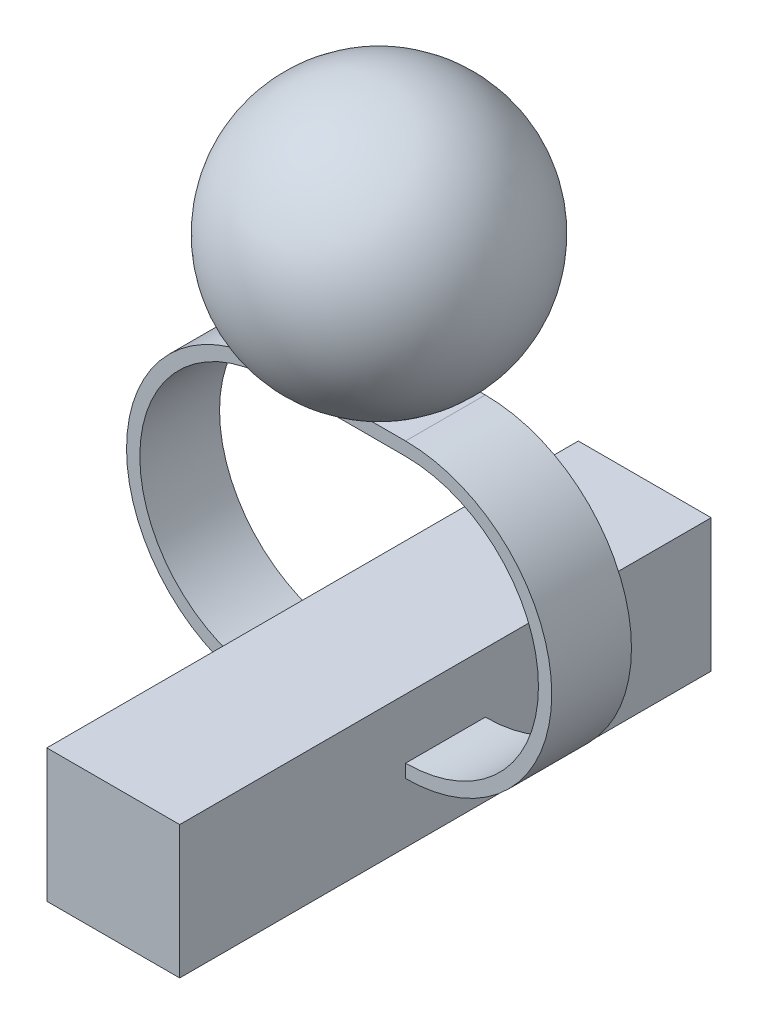
ISO-10303-21;
HEADER;
FILE_DESCRIPTION(('STEP AP214'),'2;1');
FILE_NAME('part.step','',(''),(''),'','','');
FILE_SCHEMA(('AUTOMOTIVE_DESIGN { 1 0 10303 214 1 1 1 1 }'));
ENDSEC;
DATA;
#1=APPLICATION_CONTEXT('core data for automotive mechanical design processes');
#2=APPLICATION_PROTOCOL_DEFINITION('international standard','automotive_design',2000,#1);
#3=PRODUCT_CONTEXT('',#1,'mechanical');
#4=PRODUCT('Part','Part','',(#3));
#5=PRODUCT_RELATED_PRODUCT_CATEGORY('part','',(#4));
#6=PRODUCT_DEFINITION_FORMATION('','',#4);
#7=PRODUCT_DEFINITION_CONTEXT('part definition',#1,'design');
#8=PRODUCT_DEFINITION('design','',#6,#7);
#9=PRODUCT_DEFINITION_SHAPE('','',#8);
#10=(LENGTH_UNIT() NAMED_UNIT(*) SI_UNIT(.MILLI.,.METRE.));
#11=(NAMED_UNIT(*) PLANE_ANGLE_UNIT() SI_UNIT($,.RADIAN.));
#12=(NAMED_UNIT(*) SI_UNIT($,.STERADIAN.) SOLID_ANGLE_UNIT());
#13=UNCERTAINTY_MEASURE_WITH_UNIT(LENGTH_MEASURE(1.E-05),#10,'distance_accuracy_value','');
#14=(GEOMETRIC_REPRESENTATION_CONTEXT(3) GLOBAL_UNCERTAINTY_ASSIGNED_CONTEXT((#13)) GLOBAL_UNIT_ASSIGNED_CONTEXT((#10,
#11,#12)) REPRESENTATION_CONTEXT('',''));
#15=CARTESIAN_POINT('',(0.,0.,0.));
#16=DIRECTION('',(0.,0.,1.));
#17=DIRECTION('',(1.,0.,0.));
#18=AXIS2_PLACEMENT_3D('',#15,#16,#17);
#19=CARTESIAN_POINT('',(-2.5,10.75,1.5));
#20=DIRECTION('',(0.,-1.,0.));
#21=DIRECTION('',(0.,0.,-1.));
#22=AXIS2_PLACEMENT_3D('',#19,#20,#21);
#23=PLANE('',#22);
#24=CARTESIAN_POINT('',(0.,10.75,0.));
#25=DIRECTION('',(0.,-1.,0.));
#26=DIRECTION('',(0.,0.,-1.));
#27=AXIS2_PLACEMENT_3D('',#24,#25,#26);
#28=CIRCLE('',#27,1.5612494995996);
#29=CARTESIAN_POINT('',(-0.433012701892225,10.75,-1.5));
#30=VERTEX_POINT('',#29);
#31=CARTESIAN_POINT('',(-0.433012701892225,10.75,1.5));
#32=VERTEX_POINT('',#31);
#33=EDGE_CURVE('E11',#30,#32,#28,.F.);
#34=ORIENTED_EDGE('',*,*,#33,.F.);
#35=DIRECTION('',(-1.,0.,0.));
#36=VECTOR('',#35,1.);
#37=CARTESIAN_POINT('',(-2.5,10.75,-1.5));
#38=LINE('',#37,#36);
#39=CARTESIAN_POINT('',(-2.5,10.75,-1.5));
#40=VERTEX_POINT('',#39);
#41=EDGE_CURVE('E139',#30,#40,#38,.T.);
#42=ORIENTED_EDGE('',*,*,#41,.T.);
#43=DIRECTION('',(0.,0.,-1.));
#44=VECTOR('',#43,1.);
#45=CARTESIAN_POINT('',(-2.5,10.75,1.5));
#46=LINE('',#45,#44);
#47=CARTESIAN_POINT('',(-2.5,10.75,1.5));
#48=VERTEX_POINT('',#47);
#49=EDGE_CURVE('E192',#48,#40,#46,.T.);
#50=ORIENTED_EDGE('',*,*,#49,.F.);
#51=DIRECTION('',(-1.,0.,0.));
#52=VECTOR('',#51,1.);
#53=CARTESIAN_POINT('',(-2.5,10.75,1.5));
#54=LINE('',#53,#52);
#55=EDGE_CURVE('E210',#32,#48,#54,.T.);
#56=ORIENTED_EDGE('',*,*,#55,.F.);
#57=EDGE_LOOP('',(#34,#42,#50,#56));
#58=FACE_BOUND('',#57,.T.);
#59=ADVANCED_FACE('F33',(#58),#23,.F.);
#60=CARTESIAN_POINT('',(2.5,2.5,10.));
#61=DIRECTION('',(-1.,0.,0.));
#62=DIRECTION('',(0.,0.,1.));
#63=AXIS2_PLACEMENT_3D('',#60,#61,#62);
#64=PLANE('',#63);
#65=DIRECTION('',(0.,1.,0.));
#66=VECTOR('',#65,1.);
#67=CARTESIAN_POINT('',(2.5,2.5,-10.));
#68=LINE('',#67,#66);
#69=CARTESIAN_POINT('',(2.5,-2.5,-10.));
#70=VERTEX_POINT('',#69);
#71=CARTESIAN_POINT('',(2.5,2.5,-10.));
#72=VERTEX_POINT('',#71);
#73=EDGE_CURVE('E176',#70,#72,#68,.T.);
#74=ORIENTED_EDGE('',*,*,#73,.T.);
#75=DIRECTION('',(0.,0.,-1.));
#76=VECTOR('',#75,1.);
#77=CARTESIAN_POINT('',(2.5,2.5,10.));
#78=LINE('',#77,#76);
#79=CARTESIAN_POINT('',(2.5,2.5,10.));
#80=VERTEX_POINT('',#79);
#81=EDGE_CURVE('E154',#80,#72,#78,.T.);
#82=ORIENTED_EDGE('',*,*,#81,.F.);
#83=DIRECTION('',(0.,1.,0.));
#84=VECTOR('',#83,1.);
#85=CARTESIAN_POINT('',(2.5,2.5,10.));
#86=LINE('',#85,#84);
#87=CARTESIAN_POINT('',(2.5,-2.5,10.));
#88=VERTEX_POINT('',#87);
#89=EDGE_CURVE('E171',#88,#80,#86,.T.);
#90=ORIENTED_EDGE('',*,*,#89,.F.);
#91=DIRECTION('',(0.,0.,-1.));
#92=VECTOR('',#91,1.);
#93=CARTESIAN_POINT('',(2.5,-2.5,10.));
#94=LINE('',#93,#92);
#95=EDGE_CURVE('E165',#88,#70,#94,.T.);
#96=ORIENTED_EDGE('',*,*,#95,.T.);
#97=EDGE_LOOP('',(#74,#82,#90,#96));
#98=FACE_BOUND('',#97,.T.);
#99=DIRECTION('',(0.,-1.,0.));
#100=VECTOR('',#99,1.);
#101=CARTESIAN_POINT('',(2.5,2.5,1.5));
#102=LINE('',#101,#100);
#103=CARTESIAN_POINT('',(2.5,0.25,1.5));
#104=VERTEX_POINT('',#103);
#105=CARTESIAN_POINT('',(2.5,-0.25,1.5));
#106=VERTEX_POINT('',#105);
#107=EDGE_CURVE('E206',#104,#106,#102,.T.);
#108=ORIENTED_EDGE('',*,*,#107,.F.);
#109=DIRECTION('',(0.,0.,-1.));
#110=VECTOR('',#109,1.);
#111=CARTESIAN_POINT('',(2.5,0.25,1.5));
#112=LINE('',#111,#110);
#113=CARTESIAN_POINT('',(2.5,0.25,-1.5));
#114=VERTEX_POINT('',#113);
#115=EDGE_CURVE('E225',#104,#114,#112,.T.);
#116=ORIENTED_EDGE('',*,*,#115,.T.);
#117=DIRECTION('',(0.,-1.,0.));
#118=VECTOR('',#117,1.);
#119=CARTESIAN_POINT('',(2.5,2.5,-1.5));
#120=LINE('',#119,#118);
#121=CARTESIAN_POINT('',(2.5,-0.25,-1.5));
#122=VERTEX_POINT('',#121);
#123=EDGE_CURVE('E215',#114,#122,#120,.T.);
#124=ORIENTED_EDGE('',*,*,#123,.T.);
#125=DIRECTION('',(0.,0.,-1.));
#126=VECTOR('',#125,1.);
#127=CARTESIAN_POINT('',(2.5,-0.25,1.5));
#128=LINE('',#127,#126);
#129=EDGE_CURVE('E218',#106,#122,#128,.T.);
#130=ORIENTED_EDGE('',*,*,#129,.F.);
#131=EDGE_LOOP('',(#108,#116,#124,#130));
#132=FACE_BOUND('',#131,.T.);
#133=ADVANCED_FACE('F35',(#98,#132),#64,.F.);
#134=CARTESIAN_POINT('',(-2.5,2.5,10.));
#135=DIRECTION('',(1.,0.,0.));
#136=DIRECTION('',(0.,1.,0.));
#137=AXIS2_PLACEMENT_3D('',#134,#135,#136);
#138=PLANE('',#137);
#139=DIRECTION('',(0.,-1.,0.));
#140=VECTOR('',#139,1.);
#141=CARTESIAN_POINT('',(-2.5,2.5,-10.));
#142=LINE('',#141,#140);
#143=CARTESIAN_POINT('',(-2.5,2.5,-10.));
#144=VERTEX_POINT('',#143);
#145=CARTESIAN_POINT('',(-2.5,-2.5,-10.));
#146=VERTEX_POINT('',#145);
#147=EDGE_CURVE('E172',#144,#146,#142,.T.);
#148=ORIENTED_EDGE('',*,*,#147,.T.);
#149=DIRECTION('',(0.,0.,-1.));
#150=VECTOR('',#149,1.);
#151=CARTESIAN_POINT('',(-2.5,-2.5,10.));
#152=LINE('',#151,#150);
#153=CARTESIAN_POINT('',(-2.5,-2.5,10.));
#154=VERTEX_POINT('',#153);
#155=EDGE_CURVE('E162',#154,#146,#152,.T.);
#156=ORIENTED_EDGE('',*,*,#155,.F.);
#157=DIRECTION('',(0.,-1.,0.));
#158=VECTOR('',#157,1.);
#159=CARTESIAN_POINT('',(-2.5,2.5,10.));
#160=LINE('',#159,#158);
#161=CARTESIAN_POINT('',(-2.5,2.5,10.));
#162=VERTEX_POINT('',#161);
#163=EDGE_CURVE('E181',#162,#154,#160,.T.);
#164=ORIENTED_EDGE('',*,*,#163,.F.);
#165=DIRECTION('',(0.,0.,-1.));
#166=VECTOR('',#165,1.);
#167=CARTESIAN_POINT('',(-2.5,2.5,10.));
#168=LINE('',#167,#166);
#169=EDGE_CURVE('E159',#162,#144,#168,.T.);
#170=ORIENTED_EDGE('',*,*,#169,.T.);
#171=EDGE_LOOP('',(#148,#156,#164,#170));
#172=FACE_BOUND('',#171,.T.);
#173=DIRECTION('',(0.,1.,0.));
#174=VECTOR('',#173,1.);
#175=CARTESIAN_POINT('',(-2.5,2.5,1.5));
#176=LINE('',#175,#174);
#177=CARTESIAN_POINT('',(-2.5,-0.25,1.5));
#178=VERTEX_POINT('',#177);
#179=CARTESIAN_POINT('',(-2.5,0.25,1.5));
#180=VERTEX_POINT('',#179);
#181=EDGE_CURVE('E149',#178,#180,#176,.T.);
#182=ORIENTED_EDGE('',*,*,#181,.F.);
#183=DIRECTION('',(0.,0.,-1.));
#184=VECTOR('',#183,1.);
#185=CARTESIAN_POINT('',(-2.5,-0.25,1.5));
#186=LINE('',#185,#184);
#187=CARTESIAN_POINT('',(-2.5,-0.25,-1.5));
#188=VERTEX_POINT('',#187);
#189=EDGE_CURVE('E195',#178,#188,#186,.T.);
#190=ORIENTED_EDGE('',*,*,#189,.T.);
#191=DIRECTION('',(0.,1.,0.));
#192=VECTOR('',#191,1.);
#193=CARTESIAN_POINT('',(-2.5,2.5,-1.5));
#194=LINE('',#193,#192);
#195=CARTESIAN_POINT('',(-2.5,0.25,-1.5));
#196=VERTEX_POINT('',#195);
#197=EDGE_CURVE('E150',#188,#196,#194,.T.);
#198=ORIENTED_EDGE('',*,*,#197,.T.);
#199=DIRECTION('',(0.,0.,-1.));
#200=VECTOR('',#199,1.);
#201=CARTESIAN_POINT('',(-2.5,0.25,1.5));
#202=LINE('',#201,#200);
#203=EDGE_CURVE('E179',#180,#196,#202,.T.);
#204=ORIENTED_EDGE('',*,*,#203,.F.);
#205=EDGE_LOOP('',(#182,#190,#198,#204));
#206=FACE_BOUND('',#205,.T.);
#207=ADVANCED_FACE('F259',(#172,#206),#138,.F.);
#208=CARTESIAN_POINT('',(-2.5,2.5,10.));
#209=DIRECTION('',(0.,-1.,0.));
#210=DIRECTION('',(0.,0.,-1.));
#211=AXIS2_PLACEMENT_3D('',#208,#209,#210);
#212=PLANE('',#211);
#213=DIRECTION('',(-1.,0.,0.));
#214=VECTOR('',#213,1.);
#215=CARTESIAN_POINT('',(-2.5,2.5,-10.));
#216=LINE('',#215,#214);
#217=EDGE_CURVE('E174',#72,#144,#216,.T.);
#218=ORIENTED_EDGE('',*,*,#217,.T.);
#219=ORIENTED_EDGE('',*,*,#169,.F.);
#220=DIRECTION('',(-1.,0.,0.));
#221=VECTOR('',#220,1.);
#222=CARTESIAN_POINT('',(-2.5,2.5,10.));
#223=LINE('',#222,#221);
#224=EDGE_CURVE('E183',#80,#162,#223,.T.);
#225=ORIENTED_EDGE('',*,*,#224,.F.);
#226=ORIENTED_EDGE('',*,*,#81,.T.);
#227=EDGE_LOOP('',(#218,#219,#225,#226));
#228=FACE_BOUND('',#227,.T.);
#229=ADVANCED_FACE('F303',(#228),#212,.F.);
#230=CARTESIAN_POINT('',(-2.5,-2.5,10.));
#231=DIRECTION('',(0.,1.,0.));
#232=DIRECTION('',(0.,0.,1.));
#233=AXIS2_PLACEMENT_3D('',#230,#231,#232);
#234=PLANE('',#233);
#235=DIRECTION('',(1.,0.,0.));
#236=VECTOR('',#235,1.);
#237=CARTESIAN_POINT('',(-2.5,-2.5,-10.));
#238=LINE('',#237,#236);
#239=EDGE_CURVE('E169',#146,#70,#238,.T.);
#240=ORIENTED_EDGE('',*,*,#239,.T.);
#241=ORIENTED_EDGE('',*,*,#95,.F.);
#242=DIRECTION('',(1.,0.,0.));
#243=VECTOR('',#242,1.);
#244=CARTESIAN_POINT('',(-2.5,-2.5,10.));
#245=LINE('',#244,#243);
#246=EDGE_CURVE('E168',#154,#88,#245,.T.);
#247=ORIENTED_EDGE('',*,*,#246,.F.);
#248=ORIENTED_EDGE('',*,*,#155,.T.);
#249=EDGE_LOOP('',(#240,#241,#247,#248));
#250=FACE_BOUND('',#249,.T.);
#251=ADVANCED_FACE('F298',(#250),#234,.F.);
#252=CARTESIAN_POINT('',(0.,0.,10.));
#253=DIRECTION('',(0.,0.,1.));
#254=DIRECTION('',(1.,0.,0.));
#255=AXIS2_PLACEMENT_3D('',#252,#253,#254);
#256=PLANE('',#255);
#257=ORIENTED_EDGE('',*,*,#89,.T.);
#258=ORIENTED_EDGE('',*,*,#224,.T.);
#259=ORIENTED_EDGE('',*,*,#163,.T.);
#260=ORIENTED_EDGE('',*,*,#246,.T.);
#261=EDGE_LOOP('',(#257,#258,#259,#260));
#262=FACE_BOUND('',#261,.T.);
#263=ADVANCED_FACE('F275',(#262),#256,.T.);
#264=CARTESIAN_POINT('',(0.,0.,-10.));
#265=DIRECTION('',(0.,0.,1.));
#266=DIRECTION('',(1.,0.,0.));
#267=AXIS2_PLACEMENT_3D('',#264,#265,#266);
#268=PLANE('',#267);
#269=ORIENTED_EDGE('',*,*,#73,.F.);
#270=ORIENTED_EDGE('',*,*,#239,.F.);
#271=ORIENTED_EDGE('',*,*,#147,.F.);
#272=ORIENTED_EDGE('',*,*,#217,.F.);
#273=EDGE_LOOP('',(#269,#270,#271,#272));
#274=FACE_BOUND('',#273,.T.);
#275=ADVANCED_FACE('F268',(#274),#268,.F.);
#276=CARTESIAN_POINT('',(-2.5,5.25,1.5));
#277=DIRECTION('',(0.,0.,-1.));
#278=DIRECTION('',(-1.,0.,0.));
#279=AXIS2_PLACEMENT_3D('',#276,#277,#278);
#280=PLANE('',#279);
#281=CARTESIAN_POINT('',(0.,15.5,1.5));
#282=DIRECTION('',(0.,0.,-1.));
#283=DIRECTION('',(-1.,0.,0.));
#284=AXIS2_PLACEMENT_3D('',#281,#282,#283);
#285=CIRCLE('',#284,4.76969600708473);
#286=CARTESIAN_POINT('',(0.433012701892225,10.75,1.5));
#287=VERTEX_POINT('',#286);
#288=EDGE_CURVE('E48',#32,#287,#285,.F.);
#289=ORIENTED_EDGE('',*,*,#288,.F.);
#290=ORIENTED_EDGE('',*,*,#55,.T.);
#291=CARTESIAN_POINT('',(-2.5,5.25,1.5));
#292=DIRECTION('',(0.,0.,1.));
#293=DIRECTION('',(-1.,0.,0.));
#294=AXIS2_PLACEMENT_3D('',#291,#292,#293);
#295=CIRCLE('',#294,5.5);
#296=EDGE_CURVE('E198',#48,#178,#295,.T.);
#297=ORIENTED_EDGE('',*,*,#296,.T.);
#298=ORIENTED_EDGE('',*,*,#181,.T.);
#299=CARTESIAN_POINT('',(-2.5,5.25,1.5));
#300=DIRECTION('',(0.,0.,-1.));
#301=DIRECTION('',(-1.,0.,0.));
#302=AXIS2_PLACEMENT_3D('',#299,#300,#301);
#303=CIRCLE('',#302,5.);
#304=CARTESIAN_POINT('',(-2.5,10.25,1.5));
#305=VERTEX_POINT('',#304);
#306=EDGE_CURVE('E200',#180,#305,#303,.T.);
#307=ORIENTED_EDGE('',*,*,#306,.T.);
#308=DIRECTION('',(1.,0.,0.));
#309=VECTOR('',#308,1.);
#310=CARTESIAN_POINT('',(-2.5,10.25,1.5));
#311=LINE('',#310,#309);
#312=CARTESIAN_POINT('',(2.5,10.25,1.5));
#313=VERTEX_POINT('',#312);
#314=EDGE_CURVE('E211',#305,#313,#311,.T.);
#315=ORIENTED_EDGE('',*,*,#314,.T.);
#316=CARTESIAN_POINT('',(2.5,5.25,1.5));
#317=DIRECTION('',(0.,0.,1.));
#318=DIRECTION('',(1.,0.,0.));
#319=AXIS2_PLACEMENT_3D('',#316,#317,#318);
#320=CIRCLE('',#319,5.);
#321=EDGE_CURVE('E228',#104,#313,#320,.T.);
#322=ORIENTED_EDGE('',*,*,#321,.F.);
#323=ORIENTED_EDGE('',*,*,#107,.T.);
#324=CARTESIAN_POINT('',(2.5,5.25,1.5));
#325=DIRECTION('',(0.,0.,-1.));
#326=DIRECTION('',(1.,0.,0.));
#327=AXIS2_PLACEMENT_3D('',#324,#325,#326);
#328=CIRCLE('',#327,5.5);
#329=CARTESIAN_POINT('',(2.5,10.75,1.5));
#330=VERTEX_POINT('',#329);
#331=EDGE_CURVE('E232',#330,#106,#328,.T.);
#332=ORIENTED_EDGE('',*,*,#331,.F.);
#333=EDGE_CURVE('E208',#330,#287,#54,.T.);
#334=ORIENTED_EDGE('',*,*,#333,.T.);
#335=EDGE_LOOP('',(#289,#290,#297,#298,#307,#315,#322,#323,#332,#334));
#336=FACE_BOUND('',#335,.T.);
#337=ADVANCED_FACE('F266',(#336),#280,.F.);
#338=CARTESIAN_POINT('',(-2.5,5.25,-1.5));
#339=DIRECTION('',(0.,0.,-1.));
#340=DIRECTION('',(-1.,0.,0.));
#341=AXIS2_PLACEMENT_3D('',#338,#339,#340);
#342=PLANE('',#341);
#343=ORIENTED_EDGE('',*,*,#41,.F.);
#344=CARTESIAN_POINT('',(0.,15.5,-1.5));
#345=DIRECTION('',(0.,0.,-1.));
#346=DIRECTION('',(-1.,0.,0.));
#347=AXIS2_PLACEMENT_3D('',#344,#345,#346);
#348=CIRCLE('',#347,4.76969600708473);
#349=CARTESIAN_POINT('',(0.433012701892225,10.75,-1.5));
#350=VERTEX_POINT('',#349);
#351=EDGE_CURVE('E143',#30,#350,#348,.F.);
#352=ORIENTED_EDGE('',*,*,#351,.T.);
#353=CARTESIAN_POINT('',(2.5,10.75,-1.5));
#354=VERTEX_POINT('',#353);
#355=EDGE_CURVE('E131',#354,#350,#38,.T.);
#356=ORIENTED_EDGE('',*,*,#355,.F.);
#357=CARTESIAN_POINT('',(2.5,5.25,-1.5));
#358=DIRECTION('',(0.,0.,-1.));
#359=DIRECTION('',(1.,0.,0.));
#360=AXIS2_PLACEMENT_3D('',#357,#358,#359);
#361=CIRCLE('',#360,5.5);
#362=EDGE_CURVE('E233',#354,#122,#361,.T.);
#363=ORIENTED_EDGE('',*,*,#362,.T.);
#364=ORIENTED_EDGE('',*,*,#123,.F.);
#365=CARTESIAN_POINT('',(2.5,5.25,-1.5));
#366=DIRECTION('',(0.,0.,1.));
#367=DIRECTION('',(1.,0.,0.));
#368=AXIS2_PLACEMENT_3D('',#365,#366,#367);
#369=CIRCLE('',#368,5.);
#370=CARTESIAN_POINT('',(2.5,10.25,-1.5));
#371=VERTEX_POINT('',#370);
#372=EDGE_CURVE('E229',#114,#371,#369,.T.);
#373=ORIENTED_EDGE('',*,*,#372,.T.);
#374=DIRECTION('',(1.,0.,0.));
#375=VECTOR('',#374,1.);
#376=CARTESIAN_POINT('',(-2.5,10.25,-1.5));
#377=LINE('',#376,#375);
#378=CARTESIAN_POINT('',(-2.5,10.25,-1.5));
#379=VERTEX_POINT('',#378);
#380=EDGE_CURVE('E202',#379,#371,#377,.T.);
#381=ORIENTED_EDGE('',*,*,#380,.F.);
#382=CARTESIAN_POINT('',(-2.5,5.25,-1.5));
#383=DIRECTION('',(0.,0.,-1.));
#384=DIRECTION('',(-1.,0.,0.));
#385=AXIS2_PLACEMENT_3D('',#382,#383,#384);
#386=CIRCLE('',#385,5.);
#387=EDGE_CURVE('E204',#196,#379,#386,.T.);
#388=ORIENTED_EDGE('',*,*,#387,.F.);
#389=ORIENTED_EDGE('',*,*,#197,.F.);
#390=CARTESIAN_POINT('',(-2.5,5.25,-1.5));
#391=DIRECTION('',(0.,0.,1.));
#392=DIRECTION('',(-1.,0.,0.));
#393=AXIS2_PLACEMENT_3D('',#390,#391,#392);
#394=CIRCLE('',#393,5.5);
#395=EDGE_CURVE('E138',#40,#188,#394,.T.);
#396=ORIENTED_EDGE('',*,*,#395,.F.);
#397=EDGE_LOOP('',(#343,#352,#356,#363,#364,#373,#381,#388,#389,#396));
#398=FACE_BOUND('',#397,.T.);
#399=ADVANCED_FACE('F144',(#398),#342,.T.);
#400=CARTESIAN_POINT('',(-2.5,5.25,1.5));
#401=DIRECTION('',(0.,0.,-1.));
#402=DIRECTION('',(-1.,0.,0.));
#403=AXIS2_PLACEMENT_3D('',#400,#401,#402);
#404=CYLINDRICAL_SURFACE('',#403,5.);
#405=ORIENTED_EDGE('',*,*,#387,.T.);
#406=DIRECTION('',(0.,0.,-1.));
#407=VECTOR('',#406,1.);
#408=CARTESIAN_POINT('',(-2.5,10.25,1.5));
#409=LINE('',#408,#407);
#410=EDGE_CURVE('E189',#305,#379,#409,.T.);
#411=ORIENTED_EDGE('',*,*,#410,.F.);
#412=ORIENTED_EDGE('',*,*,#306,.F.);
#413=ORIENTED_EDGE('',*,*,#203,.T.);
#414=EDGE_LOOP('',(#405,#411,#412,#413));
#415=FACE_BOUND('',#414,.T.);
#416=ADVANCED_FACE('F257',(#415),#404,.F.);
#417=CARTESIAN_POINT('',(-2.5,10.25,1.5));
#418=DIRECTION('',(0.,1.,0.));
#419=DIRECTION('',(0.,0.,1.));
#420=AXIS2_PLACEMENT_3D('',#417,#418,#419);
#421=PLANE('',#420);
#422=ORIENTED_EDGE('',*,*,#380,.T.);
#423=DIRECTION('',(0.,0.,-1.));
#424=VECTOR('',#423,1.);
#425=CARTESIAN_POINT('',(2.5,10.25,1.5));
#426=LINE('',#425,#424);
#427=EDGE_CURVE('E222',#313,#371,#426,.T.);
#428=ORIENTED_EDGE('',*,*,#427,.F.);
#429=ORIENTED_EDGE('',*,*,#314,.F.);
#430=ORIENTED_EDGE('',*,*,#410,.T.);
#431=EDGE_LOOP('',(#422,#428,#429,#430));
#432=FACE_BOUND('',#431,.T.);
#433=ADVANCED_FACE('F253',(#432),#421,.F.);
#434=EDGE_CURVE('E37',#287,#350,#28,.F.);
#435=ORIENTED_EDGE('',*,*,#434,.F.);
#436=ORIENTED_EDGE('',*,*,#333,.F.);
#437=DIRECTION('',(0.,0.,-1.));
#438=VECTOR('',#437,1.);
#439=CARTESIAN_POINT('',(2.5,10.75,1.5));
#440=LINE('',#439,#438);
#441=EDGE_CURVE('E135',#330,#354,#440,.T.);
#442=ORIENTED_EDGE('',*,*,#441,.T.);
#443=ORIENTED_EDGE('',*,*,#355,.T.);
#444=EDGE_LOOP('',(#435,#436,#442,#443));
#445=FACE_BOUND('',#444,.T.);
#446=ADVANCED_FACE('F133',(#445),#23,.F.);
#447=CARTESIAN_POINT('',(-2.5,5.25,1.5));
#448=DIRECTION('',(0.,0.,-1.));
#449=DIRECTION('',(-1.,0.,0.));
#450=AXIS2_PLACEMENT_3D('',#447,#448,#449);
#451=CYLINDRICAL_SURFACE('',#450,5.5);
#452=ORIENTED_EDGE('',*,*,#395,.T.);
#453=ORIENTED_EDGE('',*,*,#189,.F.);
#454=ORIENTED_EDGE('',*,*,#296,.F.);
#455=ORIENTED_EDGE('',*,*,#49,.T.);
#456=EDGE_LOOP('',(#452,#453,#454,#455));
#457=FACE_BOUND('',#456,.T.);
#458=ADVANCED_FACE('F263',(#457),#451,.T.);
#459=CARTESIAN_POINT('',(2.5,5.25,1.5));
#460=DIRECTION('',(0.,0.,-1.));
#461=DIRECTION('',(-1.,0.,0.));
#462=AXIS2_PLACEMENT_3D('',#459,#460,#461);
#463=CYLINDRICAL_SURFACE('',#462,5.5);
#464=ORIENTED_EDGE('',*,*,#362,.F.);
#465=ORIENTED_EDGE('',*,*,#441,.F.);
#466=ORIENTED_EDGE('',*,*,#331,.T.);
#467=ORIENTED_EDGE('',*,*,#129,.T.);
#468=EDGE_LOOP('',(#464,#465,#466,#467));
#469=FACE_BOUND('',#468,.T.);
#470=ADVANCED_FACE('F242',(#469),#463,.T.);
#471=CARTESIAN_POINT('',(2.5,5.25,1.5));
#472=DIRECTION('',(0.,0.,-1.));
#473=DIRECTION('',(-1.,0.,0.));
#474=AXIS2_PLACEMENT_3D('',#471,#472,#473);
#475=CYLINDRICAL_SURFACE('',#474,5.);
#476=ORIENTED_EDGE('',*,*,#372,.F.);
#477=ORIENTED_EDGE('',*,*,#115,.F.);
#478=ORIENTED_EDGE('',*,*,#321,.T.);
#479=ORIENTED_EDGE('',*,*,#427,.T.);
#480=EDGE_LOOP('',(#476,#477,#478,#479));
#481=FACE_BOUND('',#480,.T.);
#482=ADVANCED_FACE('F248',(#481),#475,.F.);
#483=CARTESIAN_POINT('',(0.,15.5,0.));
#484=DIRECTION('',(0.,-1.,0.));
#485=DIRECTION('',(-1.,0.,0.));
#486=AXIS2_PLACEMENT_3D('',#483,#484,#485);
#487=SPHERICAL_SURFACE('',#486,5.);
#488=ORIENTED_EDGE('',*,*,#351,.F.);
#489=ORIENTED_EDGE('',*,*,#33,.T.);
#490=ORIENTED_EDGE('',*,*,#288,.T.);
#491=ORIENTED_EDGE('',*,*,#434,.T.);
#492=EDGE_LOOP('',(#488,#489,#490,#491));
#493=FACE_BOUND('',#492,.T.);
#494=ADVANCED_FACE('F148',(#493),#487,.T.);
#495=CLOSED_SHELL('',(#59,#133,#207,#229,#251,#263,#275,#337,#399,#416,#433,#446,#458,#470,#482,#494));
#496=MANIFOLD_SOLID_BREP('B2',#495);
#497=ADVANCED_BREP_SHAPE_REPRESENTATION('',(#18,#496),#14);
#498=SHAPE_DEFINITION_REPRESENTATION(#9,#497);
ENDSEC;
END-ISO-10303-21;
